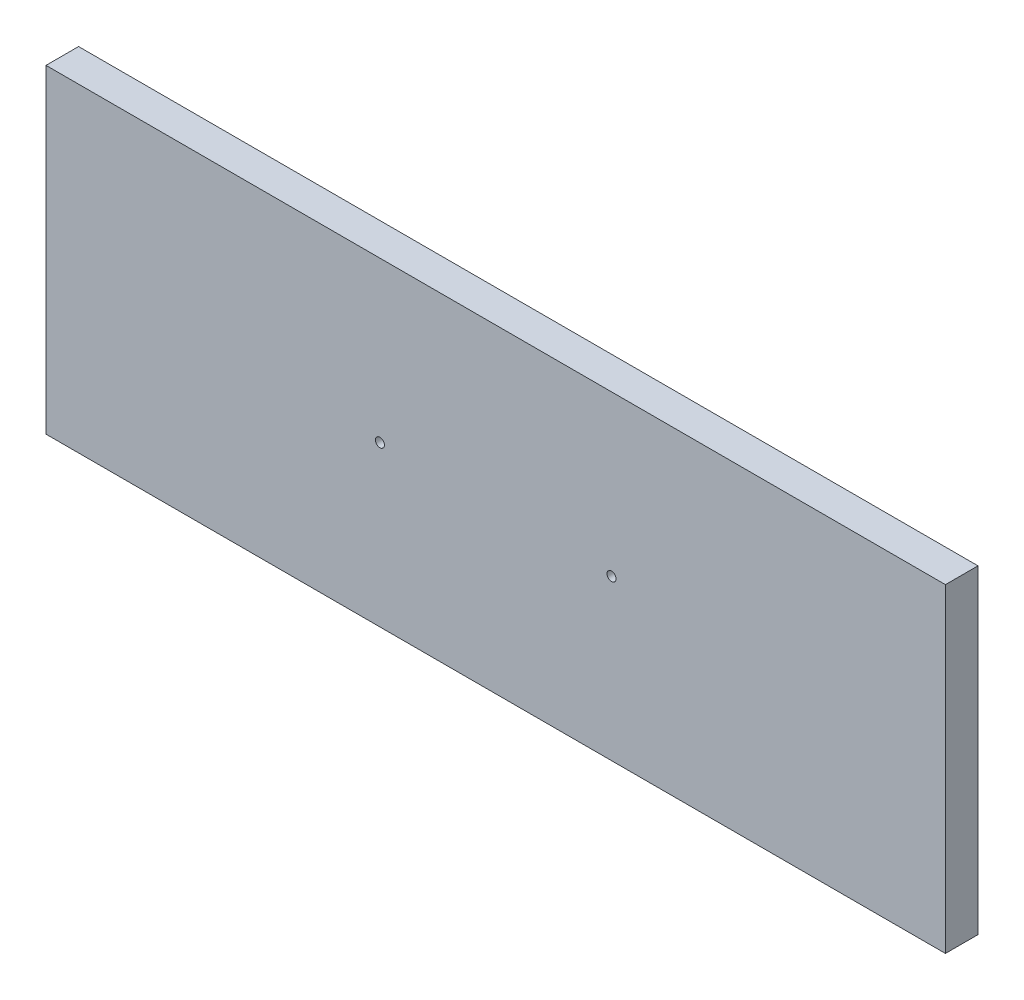
ISO-10303-21;
HEADER;
FILE_DESCRIPTION(('STEP AP214'),'2;1');
FILE_NAME('part.step','',(''),(''),'','','');
FILE_SCHEMA(('AUTOMOTIVE_DESIGN { 1 0 10303 214 1 1 1 1 }'));
ENDSEC;
DATA;
#1=APPLICATION_CONTEXT('core data for automotive mechanical design processes');
#2=APPLICATION_PROTOCOL_DEFINITION('international standard','automotive_design',2000,#1);
#3=PRODUCT_CONTEXT('',#1,'mechanical');
#4=PRODUCT('Part','Part','',(#3));
#5=PRODUCT_RELATED_PRODUCT_CATEGORY('part','',(#4));
#6=PRODUCT_DEFINITION_FORMATION('','',#4);
#7=PRODUCT_DEFINITION_CONTEXT('part definition',#1,'design');
#8=PRODUCT_DEFINITION('design','',#6,#7);
#9=PRODUCT_DEFINITION_SHAPE('','',#8);
#10=(LENGTH_UNIT() NAMED_UNIT(*) SI_UNIT(.MILLI.,.METRE.));
#11=(NAMED_UNIT(*) PLANE_ANGLE_UNIT() SI_UNIT($,.RADIAN.));
#12=(NAMED_UNIT(*) SI_UNIT($,.STERADIAN.) SOLID_ANGLE_UNIT());
#13=UNCERTAINTY_MEASURE_WITH_UNIT(LENGTH_MEASURE(1.E-05),#10,'distance_accuracy_value','');
#14=(GEOMETRIC_REPRESENTATION_CONTEXT(3) GLOBAL_UNCERTAINTY_ASSIGNED_CONTEXT((#13)) GLOBAL_UNIT_ASSIGNED_CONTEXT((#10,
#11,#12)) REPRESENTATION_CONTEXT('',''));
#15=CARTESIAN_POINT('',(0.,0.,0.));
#16=DIRECTION('',(0.,0.,1.));
#17=DIRECTION('',(1.,0.,0.));
#18=AXIS2_PLACEMENT_3D('',#15,#16,#17);
#19=CARTESIAN_POINT('',(0.,0.,18.));
#20=DIRECTION('',(0.,0.,1.));
#21=DIRECTION('',(1.,0.,0.));
#22=AXIS2_PLACEMENT_3D('',#19,#20,#21);
#23=PLANE('',#22);
#24=CARTESIAN_POINT('',(64.0000000000001,-482.25,18.));
#25=DIRECTION('',(0.,0.,1.));
#26=DIRECTION('',(1.,0.,0.));
#27=AXIS2_PLACEMENT_3D('',#24,#25,#26);
#28=CIRCLE('',#27,2.5);
#29=CARTESIAN_POINT('',(66.5000000000001,-482.25,18.));
#30=VERTEX_POINT('',#29);
#31=EDGE_CURVE('E100',#30,#30,#28,.T.);
#32=ORIENTED_EDGE('',*,*,#31,.F.);
#33=EDGE_LOOP('',(#32));
#34=FACE_BOUND('',#33,.T.);
#35=DIRECTION('',(0.,1.,0.));
#36=VECTOR('',#35,1.);
#37=CARTESIAN_POINT('',(248.5,-570.5,18.));
#38=LINE('',#37,#36);
#39=CARTESIAN_POINT('',(248.5,-570.5,18.));
#40=VERTEX_POINT('',#39);
#41=CARTESIAN_POINT('',(248.5,-394.,18.));
#42=VERTEX_POINT('',#41);
#43=EDGE_CURVE('E85',#40,#42,#38,.T.);
#44=ORIENTED_EDGE('',*,*,#43,.T.);
#45=DIRECTION('',(-1.,0.,0.));
#46=VECTOR('',#45,1.);
#47=CARTESIAN_POINT('',(248.5,-394.,18.));
#48=LINE('',#47,#46);
#49=CARTESIAN_POINT('',(-248.5,-394.,18.));
#50=VERTEX_POINT('',#49);
#51=EDGE_CURVE('E80',#42,#50,#48,.T.);
#52=ORIENTED_EDGE('',*,*,#51,.T.);
#53=DIRECTION('',(0.,-1.,0.));
#54=VECTOR('',#53,1.);
#55=CARTESIAN_POINT('',(-248.5,-394.,18.));
#56=LINE('',#55,#54);
#57=CARTESIAN_POINT('',(-248.5,-570.5,18.));
#58=VERTEX_POINT('',#57);
#59=EDGE_CURVE('E83',#50,#58,#56,.T.);
#60=ORIENTED_EDGE('',*,*,#59,.T.);
#61=DIRECTION('',(1.,0.,0.));
#62=VECTOR('',#61,1.);
#63=CARTESIAN_POINT('',(-248.5,-570.5,18.));
#64=LINE('',#63,#62);
#65=EDGE_CURVE('E50',#58,#40,#64,.T.);
#66=ORIENTED_EDGE('',*,*,#65,.T.);
#67=EDGE_LOOP('',(#44,#52,#60,#66));
#68=FACE_BOUND('',#67,.T.);
#69=CARTESIAN_POINT('',(-63.9999999999999,-482.25,18.));
#70=DIRECTION('',(0.,0.,1.));
#71=DIRECTION('',(1.,0.,0.));
#72=AXIS2_PLACEMENT_3D('',#69,#70,#71);
#73=CIRCLE('',#72,2.49999999999998);
#74=CARTESIAN_POINT('',(-61.4999999999999,-482.25,18.));
#75=VERTEX_POINT('',#74);
#76=EDGE_CURVE('E115',#75,#75,#73,.T.);
#77=ORIENTED_EDGE('',*,*,#76,.F.);
#78=EDGE_LOOP('',(#77));
#79=FACE_BOUND('',#78,.T.);
#80=ADVANCED_FACE('F33',(#34,#68,#79),#23,.T.);
#81=CARTESIAN_POINT('',(0.,0.,0.));
#82=DIRECTION('',(0.,0.,1.));
#83=DIRECTION('',(1.,0.,0.));
#84=AXIS2_PLACEMENT_3D('',#81,#82,#83);
#85=PLANE('',#84);
#86=CARTESIAN_POINT('',(224.,-450.,0.));
#87=DIRECTION('',(0.,0.,-1.));
#88=DIRECTION('',(1.,0.,0.));
#89=AXIS2_PLACEMENT_3D('',#86,#87,#88);
#90=CIRCLE('',#89,5.00000000000002);
#91=CARTESIAN_POINT('',(219.,-450.,0.));
#92=VERTEX_POINT('',#91);
#93=EDGE_CURVE('E142',#92,#92,#90,.T.);
#94=ORIENTED_EDGE('',*,*,#93,.F.);
#95=EDGE_LOOP('',(#94));
#96=FACE_BOUND('',#95,.T.);
#97=CARTESIAN_POINT('',(-224.,-450.,0.));
#98=DIRECTION('',(0.,0.,-1.));
#99=DIRECTION('',(-1.,0.,0.));
#100=AXIS2_PLACEMENT_3D('',#97,#98,#99);
#101=CIRCLE('',#100,4.99999999999999);
#102=CARTESIAN_POINT('',(-229.,-450.,0.));
#103=VERTEX_POINT('',#102);
#104=EDGE_CURVE('E136',#103,#103,#101,.T.);
#105=ORIENTED_EDGE('',*,*,#104,.F.);
#106=EDGE_LOOP('',(#105));
#107=FACE_BOUND('',#106,.T.);
#108=CARTESIAN_POINT('',(224.,-514.,0.));
#109=DIRECTION('',(0.,0.,-1.));
#110=DIRECTION('',(1.,0.,0.));
#111=AXIS2_PLACEMENT_3D('',#108,#109,#110);
#112=CIRCLE('',#111,5.00000000000002);
#113=CARTESIAN_POINT('',(219.,-514.,0.));
#114=VERTEX_POINT('',#113);
#115=EDGE_CURVE('E130',#114,#114,#112,.T.);
#116=ORIENTED_EDGE('',*,*,#115,.F.);
#117=EDGE_LOOP('',(#116));
#118=FACE_BOUND('',#117,.T.);
#119=CARTESIAN_POINT('',(-224.,-514.,0.));
#120=DIRECTION('',(0.,0.,-1.));
#121=DIRECTION('',(-1.,0.,0.));
#122=AXIS2_PLACEMENT_3D('',#119,#120,#121);
#123=CIRCLE('',#122,4.99999999999999);
#124=CARTESIAN_POINT('',(-229.,-514.,0.));
#125=VERTEX_POINT('',#124);
#126=EDGE_CURVE('E124',#125,#125,#123,.T.);
#127=ORIENTED_EDGE('',*,*,#126,.F.);
#128=EDGE_LOOP('',(#127));
#129=FACE_BOUND('',#128,.T.);
#130=CARTESIAN_POINT('',(64.0000000000001,-482.25,0.));
#131=DIRECTION('',(0.,0.,1.));
#132=DIRECTION('',(1.,0.,0.));
#133=AXIS2_PLACEMENT_3D('',#130,#131,#132);
#134=CIRCLE('',#133,2.5);
#135=CARTESIAN_POINT('',(66.5000000000001,-482.25,0.));
#136=VERTEX_POINT('',#135);
#137=EDGE_CURVE('E112',#136,#136,#134,.T.);
#138=ORIENTED_EDGE('',*,*,#137,.T.);
#139=EDGE_LOOP('',(#138));
#140=FACE_BOUND('',#139,.T.);
#141=DIRECTION('',(0.,1.,0.));
#142=VECTOR('',#141,1.);
#143=CARTESIAN_POINT('',(248.5,-570.5,0.));
#144=LINE('',#143,#142);
#145=CARTESIAN_POINT('',(248.5,-570.5,0.));
#146=VERTEX_POINT('',#145);
#147=CARTESIAN_POINT('',(248.5,-394.,0.));
#148=VERTEX_POINT('',#147);
#149=EDGE_CURVE('E97',#146,#148,#144,.T.);
#150=ORIENTED_EDGE('',*,*,#149,.F.);
#151=DIRECTION('',(1.,0.,0.));
#152=VECTOR('',#151,1.);
#153=CARTESIAN_POINT('',(-248.5,-570.5,0.));
#154=LINE('',#153,#152);
#155=CARTESIAN_POINT('',(-248.5,-570.5,0.));
#156=VERTEX_POINT('',#155);
#157=EDGE_CURVE('E73',#156,#146,#154,.T.);
#158=ORIENTED_EDGE('',*,*,#157,.F.);
#159=DIRECTION('',(0.,-1.,0.));
#160=VECTOR('',#159,1.);
#161=CARTESIAN_POINT('',(-248.5,-394.,0.));
#162=LINE('',#161,#160);
#163=CARTESIAN_POINT('',(-248.5,-394.,0.));
#164=VERTEX_POINT('',#163);
#165=EDGE_CURVE('E67',#164,#156,#162,.T.);
#166=ORIENTED_EDGE('',*,*,#165,.F.);
#167=DIRECTION('',(-1.,0.,0.));
#168=VECTOR('',#167,1.);
#169=CARTESIAN_POINT('',(248.5,-394.,0.));
#170=LINE('',#169,#168);
#171=EDGE_CURVE('E89',#148,#164,#170,.T.);
#172=ORIENTED_EDGE('',*,*,#171,.F.);
#173=EDGE_LOOP('',(#150,#158,#166,#172));
#174=FACE_BOUND('',#173,.T.);
#175=CARTESIAN_POINT('',(-63.9999999999999,-482.25,0.));
#176=DIRECTION('',(0.,0.,1.));
#177=DIRECTION('',(1.,0.,0.));
#178=AXIS2_PLACEMENT_3D('',#175,#176,#177);
#179=CIRCLE('',#178,2.49999999999998);
#180=CARTESIAN_POINT('',(-61.4999999999999,-482.25,0.));
#181=VERTEX_POINT('',#180);
#182=EDGE_CURVE('E118',#181,#181,#179,.T.);
#183=ORIENTED_EDGE('',*,*,#182,.T.);
#184=EDGE_LOOP('',(#183));
#185=FACE_BOUND('',#184,.T.);
#186=ADVANCED_FACE('F108',(#96,#107,#118,#129,#140,#174,#185),#85,.F.);
#187=CARTESIAN_POINT('',(248.5,-570.5,18.));
#188=DIRECTION('',(-1.,0.,0.));
#189=DIRECTION('',(0.,-1.,0.));
#190=AXIS2_PLACEMENT_3D('',#187,#188,#189);
#191=PLANE('',#190);
#192=ORIENTED_EDGE('',*,*,#149,.T.);
#193=DIRECTION('',(0.,0.,-1.));
#194=VECTOR('',#193,1.);
#195=CARTESIAN_POINT('',(248.5,-394.,18.));
#196=LINE('',#195,#194);
#197=EDGE_CURVE('E11',#42,#148,#196,.T.);
#198=ORIENTED_EDGE('',*,*,#197,.F.);
#199=ORIENTED_EDGE('',*,*,#43,.F.);
#200=DIRECTION('',(0.,0.,-1.));
#201=VECTOR('',#200,1.);
#202=CARTESIAN_POINT('',(248.5,-570.5,18.));
#203=LINE('',#202,#201);
#204=EDGE_CURVE('E93',#40,#146,#203,.T.);
#205=ORIENTED_EDGE('',*,*,#204,.T.);
#206=EDGE_LOOP('',(#192,#198,#199,#205));
#207=FACE_BOUND('',#206,.T.);
#208=ADVANCED_FACE('F35',(#207),#191,.F.);
#209=CARTESIAN_POINT('',(248.5,-394.,18.));
#210=DIRECTION('',(0.,-1.,0.));
#211=DIRECTION('',(1.,0.,0.));
#212=AXIS2_PLACEMENT_3D('',#209,#210,#211);
#213=PLANE('',#212);
#214=ORIENTED_EDGE('',*,*,#171,.T.);
#215=DIRECTION('',(0.,0.,-1.));
#216=VECTOR('',#215,1.);
#217=CARTESIAN_POINT('',(-248.5,-394.,18.));
#218=LINE('',#217,#216);
#219=EDGE_CURVE('E42',#50,#164,#218,.T.);
#220=ORIENTED_EDGE('',*,*,#219,.F.);
#221=ORIENTED_EDGE('',*,*,#51,.F.);
#222=ORIENTED_EDGE('',*,*,#197,.T.);
#223=EDGE_LOOP('',(#214,#220,#221,#222));
#224=FACE_BOUND('',#223,.T.);
#225=ADVANCED_FACE('F88',(#224),#213,.F.);
#226=CARTESIAN_POINT('',(-248.5,-394.,18.));
#227=DIRECTION('',(1.,0.,0.));
#228=DIRECTION('',(0.,1.,0.));
#229=AXIS2_PLACEMENT_3D('',#226,#227,#228);
#230=PLANE('',#229);
#231=ORIENTED_EDGE('',*,*,#165,.T.);
#232=DIRECTION('',(0.,0.,-1.));
#233=VECTOR('',#232,1.);
#234=CARTESIAN_POINT('',(-248.5,-570.5,18.));
#235=LINE('',#234,#233);
#236=EDGE_CURVE('E90',#58,#156,#235,.T.);
#237=ORIENTED_EDGE('',*,*,#236,.F.);
#238=ORIENTED_EDGE('',*,*,#59,.F.);
#239=ORIENTED_EDGE('',*,*,#219,.T.);
#240=EDGE_LOOP('',(#231,#237,#238,#239));
#241=FACE_BOUND('',#240,.T.);
#242=ADVANCED_FACE('F91',(#241),#230,.F.);
#243=CARTESIAN_POINT('',(-248.5,-570.5,18.));
#244=DIRECTION('',(0.,1.,0.));
#245=DIRECTION('',(0.,0.,1.));
#246=AXIS2_PLACEMENT_3D('',#243,#244,#245);
#247=PLANE('',#246);
#248=ORIENTED_EDGE('',*,*,#157,.T.);
#249=ORIENTED_EDGE('',*,*,#204,.F.);
#250=ORIENTED_EDGE('',*,*,#65,.F.);
#251=ORIENTED_EDGE('',*,*,#236,.T.);
#252=EDGE_LOOP('',(#248,#249,#250,#251));
#253=FACE_BOUND('',#252,.T.);
#254=ADVANCED_FACE('F105',(#253),#247,.F.);
#255=CARTESIAN_POINT('',(64.0000000000001,-482.25,18.));
#256=DIRECTION('',(0.,0.,-1.));
#257=DIRECTION('',(-1.,0.,0.));
#258=AXIS2_PLACEMENT_3D('',#255,#256,#257);
#259=CYLINDRICAL_SURFACE('',#258,2.5);
#260=ORIENTED_EDGE('',*,*,#31,.T.);
#261=EDGE_LOOP('',(#260));
#262=FACE_BOUND('',#261,.T.);
#263=ORIENTED_EDGE('',*,*,#137,.F.);
#264=EDGE_LOOP('',(#263));
#265=FACE_BOUND('',#264,.T.);
#266=ADVANCED_FACE('F168',(#262,#265),#259,.F.);
#267=CARTESIAN_POINT('',(-63.9999999999999,-482.25,18.));
#268=DIRECTION('',(0.,0.,-1.));
#269=DIRECTION('',(-1.,0.,0.));
#270=AXIS2_PLACEMENT_3D('',#267,#268,#269);
#271=CYLINDRICAL_SURFACE('',#270,2.49999999999998);
#272=ORIENTED_EDGE('',*,*,#76,.T.);
#273=EDGE_LOOP('',(#272));
#274=FACE_BOUND('',#273,.T.);
#275=ORIENTED_EDGE('',*,*,#182,.F.);
#276=EDGE_LOOP('',(#275));
#277=FACE_BOUND('',#276,.T.);
#278=ADVANCED_FACE('F170',(#274,#277),#271,.F.);
#279=CARTESIAN_POINT('',(-224.,-514.,13.));
#280=DIRECTION('',(0.,0.,-1.));
#281=DIRECTION('',(-1.,0.,0.));
#282=AXIS2_PLACEMENT_3D('',#279,#280,#281);
#283=CYLINDRICAL_SURFACE('',#282,4.99999999999999);
#284=CARTESIAN_POINT('',(-224.,-514.,13.));
#285=DIRECTION('',(0.,0.,-1.));
#286=DIRECTION('',(-1.,0.,0.));
#287=AXIS2_PLACEMENT_3D('',#284,#285,#286);
#288=CIRCLE('',#287,4.99999999999999);
#289=CARTESIAN_POINT('',(-229.,-514.,13.));
#290=VERTEX_POINT('',#289);
#291=EDGE_CURVE('E121',#290,#290,#288,.T.);
#292=CARTESIAN_POINT('',(-229.,-514.,13.));
#293=CARTESIAN_POINT('',(-229.,-514.,12.8645833333333));
#294=CARTESIAN_POINT('',(-229.,-514.,12.7291666666667));
#295=CARTESIAN_POINT('',(-229.,-514.,12.4583333333333));
#296=CARTESIAN_POINT('',(-229.,-514.,12.3229166666667));
#297=CARTESIAN_POINT('',(-229.,-514.,12.0520833333333));
#298=CARTESIAN_POINT('',(-229.,-514.,11.9166666666667));
#299=CARTESIAN_POINT('',(-229.,-514.,11.6458333333333));
#300=CARTESIAN_POINT('',(-229.,-514.,11.5104166666667));
#301=CARTESIAN_POINT('',(-229.,-514.,11.2395833333333));
#302=CARTESIAN_POINT('',(-229.,-514.,11.1041666666667));
#303=CARTESIAN_POINT('',(-229.,-514.,10.8333333333333));
#304=CARTESIAN_POINT('',(-229.,-514.,10.6979166666667));
#305=CARTESIAN_POINT('',(-229.,-514.,10.4270833333333));
#306=CARTESIAN_POINT('',(-229.,-514.,10.2916666666667));
#307=CARTESIAN_POINT('',(-229.,-514.,10.0208333333333));
#308=CARTESIAN_POINT('',(-229.,-514.,9.88541666666667));
#309=CARTESIAN_POINT('',(-229.,-514.,9.61458333333333));
#310=CARTESIAN_POINT('',(-229.,-514.,9.47916666666667));
#311=CARTESIAN_POINT('',(-229.,-514.,9.20833333333333));
#312=CARTESIAN_POINT('',(-229.,-514.,9.07291666666667));
#313=CARTESIAN_POINT('',(-229.,-514.,8.80208333333333));
#314=CARTESIAN_POINT('',(-229.,-514.,8.66666666666667));
#315=CARTESIAN_POINT('',(-229.,-514.,8.39583333333333));
#316=CARTESIAN_POINT('',(-229.,-514.,8.26041666666667));
#317=CARTESIAN_POINT('',(-229.,-514.,7.98958333333333));
#318=CARTESIAN_POINT('',(-229.,-514.,7.85416666666667));
#319=CARTESIAN_POINT('',(-229.,-514.,7.58333333333333));
#320=CARTESIAN_POINT('',(-229.,-514.,7.44791666666667));
#321=CARTESIAN_POINT('',(-229.,-514.,7.17708333333333));
#322=CARTESIAN_POINT('',(-229.,-514.,7.04166666666667));
#323=CARTESIAN_POINT('',(-229.,-514.,6.77083333333333));
#324=CARTESIAN_POINT('',(-229.,-514.,6.63541666666667));
#325=CARTESIAN_POINT('',(-229.,-514.,6.36458333333333));
#326=CARTESIAN_POINT('',(-229.,-514.,6.22916666666667));
#327=CARTESIAN_POINT('',(-229.,-514.,5.95833333333333));
#328=CARTESIAN_POINT('',(-229.,-514.,5.82291666666667));
#329=CARTESIAN_POINT('',(-229.,-514.,5.55208333333333));
#330=CARTESIAN_POINT('',(-229.,-514.,5.41666666666667));
#331=CARTESIAN_POINT('',(-229.,-514.,5.14583333333333));
#332=CARTESIAN_POINT('',(-229.,-514.,5.01041666666667));
#333=CARTESIAN_POINT('',(-229.,-514.,4.73958333333333));
#334=CARTESIAN_POINT('',(-229.,-514.,4.60416666666667));
#335=CARTESIAN_POINT('',(-229.,-514.,4.33333333333333));
#336=CARTESIAN_POINT('',(-229.,-514.,4.19791666666667));
#337=CARTESIAN_POINT('',(-229.,-514.,3.92708333333333));
#338=CARTESIAN_POINT('',(-229.,-514.,3.79166666666667));
#339=CARTESIAN_POINT('',(-229.,-514.,3.52083333333333));
#340=CARTESIAN_POINT('',(-229.,-514.,3.38541666666667));
#341=CARTESIAN_POINT('',(-229.,-514.,3.11458333333333));
#342=CARTESIAN_POINT('',(-229.,-514.,2.97916666666667));
#343=CARTESIAN_POINT('',(-229.,-514.,2.70833333333333));
#344=CARTESIAN_POINT('',(-229.,-514.,2.57291666666667));
#345=CARTESIAN_POINT('',(-229.,-514.,2.30208333333333));
#346=CARTESIAN_POINT('',(-229.,-514.,2.16666666666667));
#347=CARTESIAN_POINT('',(-229.,-514.,1.89583333333333));
#348=CARTESIAN_POINT('',(-229.,-514.,1.76041666666667));
#349=CARTESIAN_POINT('',(-229.,-514.,1.48958333333333));
#350=CARTESIAN_POINT('',(-229.,-514.,1.35416666666667));
#351=CARTESIAN_POINT('',(-229.,-514.,1.08333333333333));
#352=CARTESIAN_POINT('',(-229.,-514.,0.947916666666667));
#353=CARTESIAN_POINT('',(-229.,-514.,0.677083333333334));
#354=CARTESIAN_POINT('',(-229.,-514.,0.541666666666667));
#355=CARTESIAN_POINT('',(-229.,-514.,0.270833333333334));
#356=CARTESIAN_POINT('',(-229.,-514.,0.135416666666667));
#357=CARTESIAN_POINT('',(-229.,-514.,0.));
#358=B_SPLINE_CURVE_WITH_KNOTS('',3,(#292,#293,#294,#295,#296,#297,#298,#299,#300,#301,#302,
#303,#304,#305,#306,#307,#308,#309,#310,#311,#312,#313,#314,#315,#316,#317,#318,#319,#320,#321,
#322,#323,#324,#325,#326,#327,#328,#329,#330,#331,#332,#333,#334,#335,#336,#337,#338,#339,#340,
#341,#342,#343,#344,#345,#346,#347,#348,#349,#350,#351,#352,#353,#354,#355,#356,#357),
.UNSPECIFIED.,.F.,.F.,(4,2,2,2,2,2,2,2,2,2,2,2,2,2,2,2,2,2,2,2,2,2,2,2,2,2,2,2,2,2,2,2,4),(0.,
0.406249999999999,0.812499999999999,1.21875,1.625,2.03125,2.4375,2.84375,3.25,3.65625,4.0625,
4.46875,4.875,5.28125,5.6875,6.09375,6.5,6.90625,7.3125,7.71875,8.125,8.53125,8.9375,9.34375,
9.75,10.15625,10.5625,10.96875,11.375,11.78125,12.1875,12.59375,13.),.UNSPECIFIED.);
#359=EDGE_CURVE('BSEAM177',#290,#125,#358,.T.);
#360=ORIENTED_EDGE('',*,*,#291,.F.);
#361=ORIENTED_EDGE('',*,*,#126,.T.);
#362=ORIENTED_EDGE('',*,*,#359,.T.);
#363=ORIENTED_EDGE('',*,*,#359,.F.);
#364=EDGE_LOOP('',(#360,#362,#361,#363));
#365=FACE_BOUND('',#364,.T.);
#366=ADVANCED_FACE('F177',(#365),#283,.F.);
#367=CARTESIAN_POINT('',(-224.,-514.,13.));
#368=DIRECTION('',(0.,0.,-1.));
#369=DIRECTION('',(-1.,0.,0.));
#370=AXIS2_PLACEMENT_3D('',#367,#368,#369);
#371=PLANE('',#370);
#372=ORIENTED_EDGE('',*,*,#291,.T.);
#373=EDGE_LOOP('',(#372));
#374=FACE_BOUND('',#373,.T.);
#375=ADVANCED_FACE('F212',(#374),#371,.T.);
#376=CARTESIAN_POINT('',(224.,-514.,13.));
#377=DIRECTION('',(0.,0.,-1.));
#378=DIRECTION('',(-1.,0.,0.));
#379=AXIS2_PLACEMENT_3D('',#376,#377,#378);
#380=CYLINDRICAL_SURFACE('',#379,5.00000000000002);
#381=CARTESIAN_POINT('',(224.,-514.,13.));
#382=DIRECTION('',(0.,0.,-1.));
#383=DIRECTION('',(1.,0.,0.));
#384=AXIS2_PLACEMENT_3D('',#381,#382,#383);
#385=CIRCLE('',#384,5.00000000000002);
#386=CARTESIAN_POINT('',(219.,-514.,13.));
#387=VERTEX_POINT('',#386);
#388=EDGE_CURVE('E127',#387,#387,#385,.T.);
#389=CARTESIAN_POINT('',(219.,-514.,13.));
#390=CARTESIAN_POINT('',(219.,-514.,12.8645833333333));
#391=CARTESIAN_POINT('',(219.,-514.,12.7291666666667));
#392=CARTESIAN_POINT('',(219.,-514.,12.4583333333333));
#393=CARTESIAN_POINT('',(219.,-514.,12.3229166666667));
#394=CARTESIAN_POINT('',(219.,-514.,12.0520833333333));
#395=CARTESIAN_POINT('',(219.,-514.,11.9166666666667));
#396=CARTESIAN_POINT('',(219.,-514.,11.6458333333333));
#397=CARTESIAN_POINT('',(219.,-514.,11.5104166666667));
#398=CARTESIAN_POINT('',(219.,-514.,11.2395833333333));
#399=CARTESIAN_POINT('',(219.,-514.,11.1041666666667));
#400=CARTESIAN_POINT('',(219.,-514.,10.8333333333333));
#401=CARTESIAN_POINT('',(219.,-514.,10.6979166666667));
#402=CARTESIAN_POINT('',(219.,-514.,10.4270833333333));
#403=CARTESIAN_POINT('',(219.,-514.,10.2916666666667));
#404=CARTESIAN_POINT('',(219.,-514.,10.0208333333333));
#405=CARTESIAN_POINT('',(219.,-514.,9.88541666666667));
#406=CARTESIAN_POINT('',(219.,-514.,9.61458333333333));
#407=CARTESIAN_POINT('',(219.,-514.,9.47916666666667));
#408=CARTESIAN_POINT('',(219.,-514.,9.20833333333333));
#409=CARTESIAN_POINT('',(219.,-514.,9.07291666666667));
#410=CARTESIAN_POINT('',(219.,-514.,8.80208333333333));
#411=CARTESIAN_POINT('',(219.,-514.,8.66666666666667));
#412=CARTESIAN_POINT('',(219.,-514.,8.39583333333333));
#413=CARTESIAN_POINT('',(219.,-514.,8.26041666666667));
#414=CARTESIAN_POINT('',(219.,-514.,7.98958333333333));
#415=CARTESIAN_POINT('',(219.,-514.,7.85416666666667));
#416=CARTESIAN_POINT('',(219.,-514.,7.58333333333333));
#417=CARTESIAN_POINT('',(219.,-514.,7.44791666666667));
#418=CARTESIAN_POINT('',(219.,-514.,7.17708333333333));
#419=CARTESIAN_POINT('',(219.,-514.,7.04166666666667));
#420=CARTESIAN_POINT('',(219.,-514.,6.77083333333333));
#421=CARTESIAN_POINT('',(219.,-514.,6.63541666666667));
#422=CARTESIAN_POINT('',(219.,-514.,6.36458333333333));
#423=CARTESIAN_POINT('',(219.,-514.,6.22916666666667));
#424=CARTESIAN_POINT('',(219.,-514.,5.95833333333333));
#425=CARTESIAN_POINT('',(219.,-514.,5.82291666666667));
#426=CARTESIAN_POINT('',(219.,-514.,5.55208333333333));
#427=CARTESIAN_POINT('',(219.,-514.,5.41666666666667));
#428=CARTESIAN_POINT('',(219.,-514.,5.14583333333333));
#429=CARTESIAN_POINT('',(219.,-514.,5.01041666666667));
#430=CARTESIAN_POINT('',(219.,-514.,4.73958333333333));
#431=CARTESIAN_POINT('',(219.,-514.,4.60416666666667));
#432=CARTESIAN_POINT('',(219.,-514.,4.33333333333333));
#433=CARTESIAN_POINT('',(219.,-514.,4.19791666666667));
#434=CARTESIAN_POINT('',(219.,-514.,3.92708333333333));
#435=CARTESIAN_POINT('',(219.,-514.,3.79166666666667));
#436=CARTESIAN_POINT('',(219.,-514.,3.52083333333333));
#437=CARTESIAN_POINT('',(219.,-514.,3.38541666666667));
#438=CARTESIAN_POINT('',(219.,-514.,3.11458333333333));
#439=CARTESIAN_POINT('',(219.,-514.,2.97916666666667));
#440=CARTESIAN_POINT('',(219.,-514.,2.70833333333333));
#441=CARTESIAN_POINT('',(219.,-514.,2.57291666666667));
#442=CARTESIAN_POINT('',(219.,-514.,2.30208333333333));
#443=CARTESIAN_POINT('',(219.,-514.,2.16666666666667));
#444=CARTESIAN_POINT('',(219.,-514.,1.89583333333333));
#445=CARTESIAN_POINT('',(219.,-514.,1.76041666666667));
#446=CARTESIAN_POINT('',(219.,-514.,1.48958333333333));
#447=CARTESIAN_POINT('',(219.,-514.,1.35416666666667));
#448=CARTESIAN_POINT('',(219.,-514.,1.08333333333333));
#449=CARTESIAN_POINT('',(219.,-514.,0.947916666666667));
#450=CARTESIAN_POINT('',(219.,-514.,0.677083333333334));
#451=CARTESIAN_POINT('',(219.,-514.,0.541666666666667));
#452=CARTESIAN_POINT('',(219.,-514.,0.270833333333334));
#453=CARTESIAN_POINT('',(219.,-514.,0.135416666666667));
#454=CARTESIAN_POINT('',(219.,-514.,0.));
#455=B_SPLINE_CURVE_WITH_KNOTS('',3,(#389,#390,#391,#392,#393,#394,#395,#396,#397,#398,#399,
#400,#401,#402,#403,#404,#405,#406,#407,#408,#409,#410,#411,#412,#413,#414,#415,#416,#417,#418,
#419,#420,#421,#422,#423,#424,#425,#426,#427,#428,#429,#430,#431,#432,#433,#434,#435,#436,#437,
#438,#439,#440,#441,#442,#443,#444,#445,#446,#447,#448,#449,#450,#451,#452,#453,#454),
.UNSPECIFIED.,.F.,.F.,(4,2,2,2,2,2,2,2,2,2,2,2,2,2,2,2,2,2,2,2,2,2,2,2,2,2,2,2,2,2,2,2,4),(0.,
0.406249999999999,0.812499999999999,1.21875,1.625,2.03125,2.4375,2.84375,3.25,3.65625,4.0625,
4.46875,4.875,5.28125,5.6875,6.09375,6.5,6.90625,7.3125,7.71875,8.125,8.53125,8.9375,9.34375,
9.75,10.15625,10.5625,10.96875,11.375,11.78125,12.1875,12.59375,13.),.UNSPECIFIED.);
#456=EDGE_CURVE('BSEAM222',#387,#114,#455,.T.);
#457=ORIENTED_EDGE('',*,*,#388,.F.);
#458=ORIENTED_EDGE('',*,*,#115,.T.);
#459=ORIENTED_EDGE('',*,*,#456,.T.);
#460=ORIENTED_EDGE('',*,*,#456,.F.);
#461=EDGE_LOOP('',(#457,#459,#458,#460));
#462=FACE_BOUND('',#461,.T.);
#463=ADVANCED_FACE('F222',(#462),#380,.F.);
#464=CARTESIAN_POINT('',(224.,-514.,13.));
#465=DIRECTION('',(0.,0.,1.));
#466=DIRECTION('',(1.,0.,0.));
#467=AXIS2_PLACEMENT_3D('',#464,#465,#466);
#468=PLANE('',#467);
#469=ORIENTED_EDGE('',*,*,#388,.T.);
#470=EDGE_LOOP('',(#469));
#471=FACE_BOUND('',#470,.T.);
#472=ADVANCED_FACE('F232',(#471),#468,.F.);
#473=CARTESIAN_POINT('',(-224.,-450.,13.));
#474=DIRECTION('',(0.,0.,-1.));
#475=DIRECTION('',(-1.,0.,0.));
#476=AXIS2_PLACEMENT_3D('',#473,#474,#475);
#477=CYLINDRICAL_SURFACE('',#476,4.99999999999999);
#478=CARTESIAN_POINT('',(-224.,-450.,13.));
#479=DIRECTION('',(0.,0.,-1.));
#480=DIRECTION('',(-1.,0.,0.));
#481=AXIS2_PLACEMENT_3D('',#478,#479,#480);
#482=CIRCLE('',#481,4.99999999999999);
#483=CARTESIAN_POINT('',(-229.,-450.,13.));
#484=VERTEX_POINT('',#483);
#485=EDGE_CURVE('E133',#484,#484,#482,.T.);
#486=CARTESIAN_POINT('',(-229.,-450.,13.));
#487=CARTESIAN_POINT('',(-229.,-450.,12.8645833333333));
#488=CARTESIAN_POINT('',(-229.,-450.,12.7291666666667));
#489=CARTESIAN_POINT('',(-229.,-450.,12.4583333333333));
#490=CARTESIAN_POINT('',(-229.,-450.,12.3229166666667));
#491=CARTESIAN_POINT('',(-229.,-450.,12.0520833333333));
#492=CARTESIAN_POINT('',(-229.,-450.,11.9166666666667));
#493=CARTESIAN_POINT('',(-229.,-450.,11.6458333333333));
#494=CARTESIAN_POINT('',(-229.,-450.,11.5104166666667));
#495=CARTESIAN_POINT('',(-229.,-450.,11.2395833333333));
#496=CARTESIAN_POINT('',(-229.,-450.,11.1041666666667));
#497=CARTESIAN_POINT('',(-229.,-450.,10.8333333333333));
#498=CARTESIAN_POINT('',(-229.,-450.,10.6979166666667));
#499=CARTESIAN_POINT('',(-229.,-450.,10.4270833333333));
#500=CARTESIAN_POINT('',(-229.,-450.,10.2916666666667));
#501=CARTESIAN_POINT('',(-229.,-450.,10.0208333333333));
#502=CARTESIAN_POINT('',(-229.,-450.,9.88541666666667));
#503=CARTESIAN_POINT('',(-229.,-450.,9.61458333333333));
#504=CARTESIAN_POINT('',(-229.,-450.,9.47916666666667));
#505=CARTESIAN_POINT('',(-229.,-450.,9.20833333333333));
#506=CARTESIAN_POINT('',(-229.,-450.,9.07291666666667));
#507=CARTESIAN_POINT('',(-229.,-450.,8.80208333333333));
#508=CARTESIAN_POINT('',(-229.,-450.,8.66666666666667));
#509=CARTESIAN_POINT('',(-229.,-450.,8.39583333333333));
#510=CARTESIAN_POINT('',(-229.,-450.,8.26041666666667));
#511=CARTESIAN_POINT('',(-229.,-450.,7.98958333333333));
#512=CARTESIAN_POINT('',(-229.,-450.,7.85416666666667));
#513=CARTESIAN_POINT('',(-229.,-450.,7.58333333333333));
#514=CARTESIAN_POINT('',(-229.,-450.,7.44791666666667));
#515=CARTESIAN_POINT('',(-229.,-450.,7.17708333333333));
#516=CARTESIAN_POINT('',(-229.,-450.,7.04166666666667));
#517=CARTESIAN_POINT('',(-229.,-450.,6.77083333333333));
#518=CARTESIAN_POINT('',(-229.,-450.,6.63541666666667));
#519=CARTESIAN_POINT('',(-229.,-450.,6.36458333333333));
#520=CARTESIAN_POINT('',(-229.,-450.,6.22916666666667));
#521=CARTESIAN_POINT('',(-229.,-450.,5.95833333333333));
#522=CARTESIAN_POINT('',(-229.,-450.,5.82291666666667));
#523=CARTESIAN_POINT('',(-229.,-450.,5.55208333333333));
#524=CARTESIAN_POINT('',(-229.,-450.,5.41666666666667));
#525=CARTESIAN_POINT('',(-229.,-450.,5.14583333333333));
#526=CARTESIAN_POINT('',(-229.,-450.,5.01041666666667));
#527=CARTESIAN_POINT('',(-229.,-450.,4.73958333333333));
#528=CARTESIAN_POINT('',(-229.,-450.,4.60416666666667));
#529=CARTESIAN_POINT('',(-229.,-450.,4.33333333333333));
#530=CARTESIAN_POINT('',(-229.,-450.,4.19791666666667));
#531=CARTESIAN_POINT('',(-229.,-450.,3.92708333333333));
#532=CARTESIAN_POINT('',(-229.,-450.,3.79166666666667));
#533=CARTESIAN_POINT('',(-229.,-450.,3.52083333333333));
#534=CARTESIAN_POINT('',(-229.,-450.,3.38541666666667));
#535=CARTESIAN_POINT('',(-229.,-450.,3.11458333333333));
#536=CARTESIAN_POINT('',(-229.,-450.,2.97916666666667));
#537=CARTESIAN_POINT('',(-229.,-450.,2.70833333333333));
#538=CARTESIAN_POINT('',(-229.,-450.,2.57291666666667));
#539=CARTESIAN_POINT('',(-229.,-450.,2.30208333333333));
#540=CARTESIAN_POINT('',(-229.,-450.,2.16666666666667));
#541=CARTESIAN_POINT('',(-229.,-450.,1.89583333333333));
#542=CARTESIAN_POINT('',(-229.,-450.,1.76041666666667));
#543=CARTESIAN_POINT('',(-229.,-450.,1.48958333333333));
#544=CARTESIAN_POINT('',(-229.,-450.,1.35416666666667));
#545=CARTESIAN_POINT('',(-229.,-450.,1.08333333333333));
#546=CARTESIAN_POINT('',(-229.,-450.,0.947916666666667));
#547=CARTESIAN_POINT('',(-229.,-450.,0.677083333333334));
#548=CARTESIAN_POINT('',(-229.,-450.,0.541666666666667));
#549=CARTESIAN_POINT('',(-229.,-450.,0.270833333333334));
#550=CARTESIAN_POINT('',(-229.,-450.,0.135416666666667));
#551=CARTESIAN_POINT('',(-229.,-450.,0.));
#552=B_SPLINE_CURVE_WITH_KNOTS('',3,(#486,#487,#488,#489,#490,#491,#492,#493,#494,#495,#496,
#497,#498,#499,#500,#501,#502,#503,#504,#505,#506,#507,#508,#509,#510,#511,#512,#513,#514,#515,
#516,#517,#518,#519,#520,#521,#522,#523,#524,#525,#526,#527,#528,#529,#530,#531,#532,#533,#534,
#535,#536,#537,#538,#539,#540,#541,#542,#543,#544,#545,#546,#547,#548,#549,#550,#551),
.UNSPECIFIED.,.F.,.F.,(4,2,2,2,2,2,2,2,2,2,2,2,2,2,2,2,2,2,2,2,2,2,2,2,2,2,2,2,2,2,2,2,4),(0.,
0.406249999999999,0.812499999999999,1.21875,1.625,2.03125,2.4375,2.84375,3.25,3.65625,4.0625,
4.46875,4.875,5.28125,5.6875,6.09375,6.5,6.90625,7.3125,7.71875,8.125,8.53125,8.9375,9.34375,
9.75,10.15625,10.5625,10.96875,11.375,11.78125,12.1875,12.59375,13.),.UNSPECIFIED.);
#553=EDGE_CURVE('BSEAM242',#484,#103,#552,.T.);
#554=ORIENTED_EDGE('',*,*,#485,.F.);
#555=ORIENTED_EDGE('',*,*,#104,.T.);
#556=ORIENTED_EDGE('',*,*,#553,.T.);
#557=ORIENTED_EDGE('',*,*,#553,.F.);
#558=EDGE_LOOP('',(#554,#556,#555,#557));
#559=FACE_BOUND('',#558,.T.);
#560=ADVANCED_FACE('F242',(#559),#477,.F.);
#561=CARTESIAN_POINT('',(-224.,-450.,13.));
#562=DIRECTION('',(0.,0.,-1.));
#563=DIRECTION('',(-1.,0.,0.));
#564=AXIS2_PLACEMENT_3D('',#561,#562,#563);
#565=PLANE('',#564);
#566=ORIENTED_EDGE('',*,*,#485,.T.);
#567=EDGE_LOOP('',(#566));
#568=FACE_BOUND('',#567,.T.);
#569=ADVANCED_FACE('F153',(#568),#565,.T.);
#570=CARTESIAN_POINT('',(224.,-450.,13.));
#571=DIRECTION('',(0.,0.,-1.));
#572=DIRECTION('',(-1.,0.,0.));
#573=AXIS2_PLACEMENT_3D('',#570,#571,#572);
#574=CYLINDRICAL_SURFACE('',#573,5.00000000000002);
#575=CARTESIAN_POINT('',(224.,-450.,13.));
#576=DIRECTION('',(0.,0.,-1.));
#577=DIRECTION('',(1.,0.,0.));
#578=AXIS2_PLACEMENT_3D('',#575,#576,#577);
#579=CIRCLE('',#578,5.00000000000002);
#580=CARTESIAN_POINT('',(219.,-450.,13.));
#581=VERTEX_POINT('',#580);
#582=EDGE_CURVE('E139',#581,#581,#579,.T.);
#583=CARTESIAN_POINT('',(219.,-450.,13.));
#584=CARTESIAN_POINT('',(219.,-450.,12.8645833333333));
#585=CARTESIAN_POINT('',(219.,-450.,12.7291666666667));
#586=CARTESIAN_POINT('',(219.,-450.,12.4583333333333));
#587=CARTESIAN_POINT('',(219.,-450.,12.3229166666667));
#588=CARTESIAN_POINT('',(219.,-450.,12.0520833333333));
#589=CARTESIAN_POINT('',(219.,-450.,11.9166666666667));
#590=CARTESIAN_POINT('',(219.,-450.,11.6458333333333));
#591=CARTESIAN_POINT('',(219.,-450.,11.5104166666667));
#592=CARTESIAN_POINT('',(219.,-450.,11.2395833333333));
#593=CARTESIAN_POINT('',(219.,-450.,11.1041666666667));
#594=CARTESIAN_POINT('',(219.,-450.,10.8333333333333));
#595=CARTESIAN_POINT('',(219.,-450.,10.6979166666667));
#596=CARTESIAN_POINT('',(219.,-450.,10.4270833333333));
#597=CARTESIAN_POINT('',(219.,-450.,10.2916666666667));
#598=CARTESIAN_POINT('',(219.,-450.,10.0208333333333));
#599=CARTESIAN_POINT('',(219.,-450.,9.88541666666667));
#600=CARTESIAN_POINT('',(219.,-450.,9.61458333333333));
#601=CARTESIAN_POINT('',(219.,-450.,9.47916666666667));
#602=CARTESIAN_POINT('',(219.,-450.,9.20833333333333));
#603=CARTESIAN_POINT('',(219.,-450.,9.07291666666667));
#604=CARTESIAN_POINT('',(219.,-450.,8.80208333333333));
#605=CARTESIAN_POINT('',(219.,-450.,8.66666666666667));
#606=CARTESIAN_POINT('',(219.,-450.,8.39583333333333));
#607=CARTESIAN_POINT('',(219.,-450.,8.26041666666667));
#608=CARTESIAN_POINT('',(219.,-450.,7.98958333333333));
#609=CARTESIAN_POINT('',(219.,-450.,7.85416666666667));
#610=CARTESIAN_POINT('',(219.,-450.,7.58333333333333));
#611=CARTESIAN_POINT('',(219.,-450.,7.44791666666667));
#612=CARTESIAN_POINT('',(219.,-450.,7.17708333333333));
#613=CARTESIAN_POINT('',(219.,-450.,7.04166666666667));
#614=CARTESIAN_POINT('',(219.,-450.,6.77083333333333));
#615=CARTESIAN_POINT('',(219.,-450.,6.63541666666667));
#616=CARTESIAN_POINT('',(219.,-450.,6.36458333333333));
#617=CARTESIAN_POINT('',(219.,-450.,6.22916666666667));
#618=CARTESIAN_POINT('',(219.,-450.,5.95833333333333));
#619=CARTESIAN_POINT('',(219.,-450.,5.82291666666667));
#620=CARTESIAN_POINT('',(219.,-450.,5.55208333333333));
#621=CARTESIAN_POINT('',(219.,-450.,5.41666666666667));
#622=CARTESIAN_POINT('',(219.,-450.,5.14583333333333));
#623=CARTESIAN_POINT('',(219.,-450.,5.01041666666667));
#624=CARTESIAN_POINT('',(219.,-450.,4.73958333333333));
#625=CARTESIAN_POINT('',(219.,-450.,4.60416666666667));
#626=CARTESIAN_POINT('',(219.,-450.,4.33333333333333));
#627=CARTESIAN_POINT('',(219.,-450.,4.19791666666667));
#628=CARTESIAN_POINT('',(219.,-450.,3.92708333333333));
#629=CARTESIAN_POINT('',(219.,-450.,3.79166666666667));
#630=CARTESIAN_POINT('',(219.,-450.,3.52083333333333));
#631=CARTESIAN_POINT('',(219.,-450.,3.38541666666667));
#632=CARTESIAN_POINT('',(219.,-450.,3.11458333333333));
#633=CARTESIAN_POINT('',(219.,-450.,2.97916666666667));
#634=CARTESIAN_POINT('',(219.,-450.,2.70833333333333));
#635=CARTESIAN_POINT('',(219.,-450.,2.57291666666667));
#636=CARTESIAN_POINT('',(219.,-450.,2.30208333333333));
#637=CARTESIAN_POINT('',(219.,-450.,2.16666666666667));
#638=CARTESIAN_POINT('',(219.,-450.,1.89583333333333));
#639=CARTESIAN_POINT('',(219.,-450.,1.76041666666667));
#640=CARTESIAN_POINT('',(219.,-450.,1.48958333333333));
#641=CARTESIAN_POINT('',(219.,-450.,1.35416666666667));
#642=CARTESIAN_POINT('',(219.,-450.,1.08333333333333));
#643=CARTESIAN_POINT('',(219.,-450.,0.947916666666667));
#644=CARTESIAN_POINT('',(219.,-450.,0.677083333333334));
#645=CARTESIAN_POINT('',(219.,-450.,0.541666666666667));
#646=CARTESIAN_POINT('',(219.,-450.,0.270833333333334));
#647=CARTESIAN_POINT('',(219.,-450.,0.135416666666667));
#648=CARTESIAN_POINT('',(219.,-450.,0.));
#649=B_SPLINE_CURVE_WITH_KNOTS('',3,(#583,#584,#585,#586,#587,#588,#589,#590,#591,#592,#593,
#594,#595,#596,#597,#598,#599,#600,#601,#602,#603,#604,#605,#606,#607,#608,#609,#610,#611,#612,
#613,#614,#615,#616,#617,#618,#619,#620,#621,#622,#623,#624,#625,#626,#627,#628,#629,#630,#631,
#632,#633,#634,#635,#636,#637,#638,#639,#640,#641,#642,#643,#644,#645,#646,#647,#648),
.UNSPECIFIED.,.F.,.F.,(4,2,2,2,2,2,2,2,2,2,2,2,2,2,2,2,2,2,2,2,2,2,2,2,2,2,2,2,2,2,2,2,4),(0.,
0.406249999999999,0.812499999999999,1.21875,1.625,2.03125,2.4375,2.84375,3.25,3.65625,4.0625,
4.46875,4.875,5.28125,5.6875,6.09375,6.5,6.90625,7.3125,7.71875,8.125,8.53125,8.9375,9.34375,
9.75,10.15625,10.5625,10.96875,11.375,11.78125,12.1875,12.59375,13.),.UNSPECIFIED.);
#650=EDGE_CURVE('BSEAM150',#581,#92,#649,.T.);
#651=ORIENTED_EDGE('',*,*,#582,.F.);
#652=ORIENTED_EDGE('',*,*,#93,.T.);
#653=ORIENTED_EDGE('',*,*,#650,.T.);
#654=ORIENTED_EDGE('',*,*,#650,.F.);
#655=EDGE_LOOP('',(#651,#653,#652,#654));
#656=FACE_BOUND('',#655,.T.);
#657=ADVANCED_FACE('F150',(#656),#574,.F.);
#658=CARTESIAN_POINT('',(224.,-450.,13.));
#659=DIRECTION('',(0.,0.,1.));
#660=DIRECTION('',(1.,0.,0.));
#661=AXIS2_PLACEMENT_3D('',#658,#659,#660);
#662=PLANE('',#661);
#663=ORIENTED_EDGE('',*,*,#582,.T.);
#664=EDGE_LOOP('',(#663));
#665=FACE_BOUND('',#664,.T.);
#666=ADVANCED_FACE('F148',(#665),#662,.F.);
#667=CLOSED_SHELL('',(#80,#186,#208,#225,#242,#254,#266,#278,#366,#375,#463,#472,#560,#569,#657,#666));
#668=MANIFOLD_SOLID_BREP('B2',#667);
#669=ADVANCED_BREP_SHAPE_REPRESENTATION('',(#18,#668),#14);
#670=SHAPE_DEFINITION_REPRESENTATION(#9,#669);
ENDSEC;
END-ISO-10303-21;
